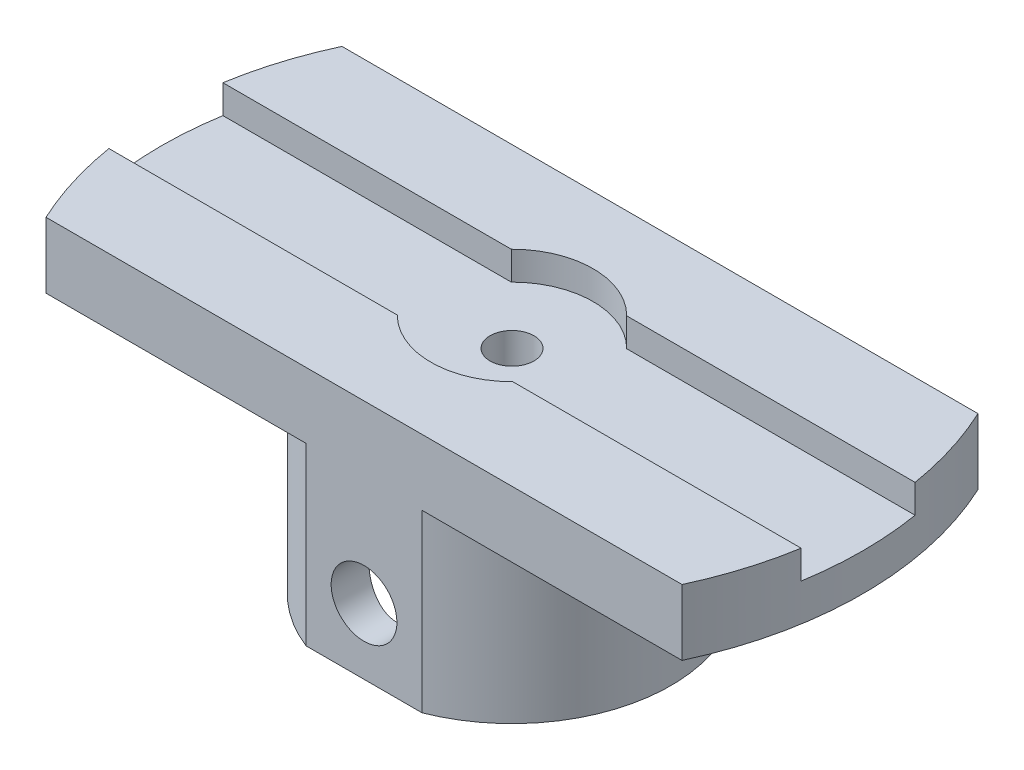
ISO-10303-21;
HEADER;
FILE_DESCRIPTION(('STEP AP214'),'2;1');
FILE_NAME('part.step','',(''),(''),'','','');
FILE_SCHEMA(('AUTOMOTIVE_DESIGN { 1 0 10303 214 1 1 1 1 }'));
ENDSEC;
DATA;
#1=APPLICATION_CONTEXT('core data for automotive mechanical design processes');
#2=APPLICATION_PROTOCOL_DEFINITION('international standard','automotive_design',2000,#1);
#3=PRODUCT_CONTEXT('',#1,'mechanical');
#4=PRODUCT('Part','Part','',(#3));
#5=PRODUCT_RELATED_PRODUCT_CATEGORY('part','',(#4));
#6=PRODUCT_DEFINITION_FORMATION('','',#4);
#7=PRODUCT_DEFINITION_CONTEXT('part definition',#1,'design');
#8=PRODUCT_DEFINITION('design','',#6,#7);
#9=PRODUCT_DEFINITION_SHAPE('','',#8);
#10=(LENGTH_UNIT() NAMED_UNIT(*) SI_UNIT(.MILLI.,.METRE.));
#11=(NAMED_UNIT(*) PLANE_ANGLE_UNIT() SI_UNIT($,.RADIAN.));
#12=(NAMED_UNIT(*) SI_UNIT($,.STERADIAN.) SOLID_ANGLE_UNIT());
#13=UNCERTAINTY_MEASURE_WITH_UNIT(LENGTH_MEASURE(1.E-05),#10,'distance_accuracy_value','');
#14=(GEOMETRIC_REPRESENTATION_CONTEXT(3) GLOBAL_UNCERTAINTY_ASSIGNED_CONTEXT((#13)) GLOBAL_UNIT_ASSIGNED_CONTEXT((#10,
#11,#12)) REPRESENTATION_CONTEXT('',''));
#15=CARTESIAN_POINT('',(0.,0.,0.));
#16=DIRECTION('',(0.,0.,1.));
#17=DIRECTION('',(1.,0.,0.));
#18=AXIS2_PLACEMENT_3D('',#15,#16,#17);
#19=CARTESIAN_POINT('',(0.,0.,0.));
#20=DIRECTION('',(0.,1.,0.));
#21=DIRECTION('',(0.,0.,1.));
#22=AXIS2_PLACEMENT_3D('',#19,#20,#21);
#23=PLANE('',#22);
#24=DIRECTION('',(-1.,0.,0.));
#25=VECTOR('',#24,1.);
#26=CARTESIAN_POINT('',(0.,0.,-6.75));
#27=LINE('',#26,#25);
#28=CARTESIAN_POINT('',(14.506464076404,0.,-6.75));
#29=VERTEX_POINT('',#28);
#30=CARTESIAN_POINT('',(2.64575131106459,0.,-6.75));
#31=VERTEX_POINT('',#30);
#32=EDGE_CURVE('E404',#29,#31,#27,.T.);
#33=ORIENTED_EDGE('',*,*,#32,.F.);
#34=CARTESIAN_POINT('',(0.,0.,0.));
#35=DIRECTION('',(0.,1.,0.));
#36=DIRECTION('',(0.,0.,1.));
#37=AXIS2_PLACEMENT_3D('',#34,#35,#36);
#38=CIRCLE('',#37,16.);
#39=CARTESIAN_POINT('',(14.506464076404,0.,6.75));
#40=VERTEX_POINT('',#39);
#41=EDGE_CURVE('E217',#40,#29,#38,.T.);
#42=ORIENTED_EDGE('',*,*,#41,.F.);
#43=DIRECTION('',(1.,0.,0.));
#44=VECTOR('',#43,1.);
#45=CARTESIAN_POINT('',(0.,0.,6.75));
#46=LINE('',#45,#44);
#47=CARTESIAN_POINT('',(2.64575131106459,0.,6.75));
#48=VERTEX_POINT('',#47);
#49=EDGE_CURVE('E394',#48,#40,#46,.T.);
#50=ORIENTED_EDGE('',*,*,#49,.F.);
#51=CARTESIAN_POINT('',(0.,0.,0.));
#52=DIRECTION('',(0.,1.,0.));
#53=DIRECTION('',(0.,0.,1.));
#54=AXIS2_PLACEMENT_3D('',#51,#52,#53);
#55=CIRCLE('',#54,7.25);
#56=EDGE_CURVE('E228',#31,#48,#55,.F.);
#57=ORIENTED_EDGE('',*,*,#56,.F.);
#58=EDGE_LOOP('',(#33,#42,#50,#57));
#59=FACE_BOUND('',#58,.T.);
#60=ADVANCED_FACE('F39',(#59),#23,.F.);
#61=CARTESIAN_POINT('',(-2.64575131106459,0.,-6.75));
#62=VERTEX_POINT('',#61);
#63=CARTESIAN_POINT('',(-14.506464076404,0.,-6.75));
#64=VERTEX_POINT('',#63);
#65=EDGE_CURVE('E405',#62,#64,#27,.T.);
#66=ORIENTED_EDGE('',*,*,#65,.F.);
#67=CARTESIAN_POINT('',(-2.64575131106459,0.,6.75));
#68=VERTEX_POINT('',#67);
#69=EDGE_CURVE('E224',#68,#62,#55,.F.);
#70=ORIENTED_EDGE('',*,*,#69,.F.);
#71=CARTESIAN_POINT('',(-14.506464076404,0.,6.75));
#72=VERTEX_POINT('',#71);
#73=EDGE_CURVE('E62',#72,#68,#46,.T.);
#74=ORIENTED_EDGE('',*,*,#73,.F.);
#75=EDGE_CURVE('E206',#64,#72,#38,.T.);
#76=ORIENTED_EDGE('',*,*,#75,.F.);
#77=EDGE_LOOP('',(#66,#70,#74,#76));
#78=FACE_BOUND('',#77,.T.);
#79=ADVANCED_FACE('F311',(#78),#23,.F.);
#80=CARTESIAN_POINT('',(0.,3.,0.));
#81=DIRECTION('',(0.,-1.,0.));
#82=DIRECTION('',(0.,0.,-1.));
#83=AXIS2_PLACEMENT_3D('',#80,#81,#82);
#84=CYLINDRICAL_SURFACE('',#83,16.);
#85=DIRECTION('',(0.,-1.,0.));
#86=VECTOR('',#85,1.);
#87=CARTESIAN_POINT('',(14.506464076404,3.,-6.75));
#88=LINE('',#87,#86);
#89=CARTESIAN_POINT('',(14.506464076404,3.,-6.75));
#90=VERTEX_POINT('',#89);
#91=EDGE_CURVE('E407',#90,#29,#88,.T.);
#92=ORIENTED_EDGE('',*,*,#91,.F.);
#93=CARTESIAN_POINT('',(0.,3.,0.));
#94=DIRECTION('',(0.,1.,0.));
#95=DIRECTION('',(0.,0.,1.));
#96=AXIS2_PLACEMENT_3D('',#93,#94,#95);
#97=CIRCLE('',#96,16.);
#98=CARTESIAN_POINT('',(15.7873366974927,3.,-2.6));
#99=VERTEX_POINT('',#98);
#100=EDGE_CURVE('E216',#99,#90,#97,.T.);
#101=ORIENTED_EDGE('',*,*,#100,.F.);
#102=DIRECTION('',(0.,1.,0.));
#103=VECTOR('',#102,1.);
#104=CARTESIAN_POINT('',(15.7873366974927,1.7,-2.6));
#105=LINE('',#104,#103);
#106=CARTESIAN_POINT('',(15.7873366974927,1.7,-2.6));
#107=VERTEX_POINT('',#106);
#108=EDGE_CURVE('E207',#107,#99,#105,.T.);
#109=ORIENTED_EDGE('',*,*,#108,.F.);
#110=CARTESIAN_POINT('',(1.83880688453542E-13,1.7,0.));
#111=DIRECTION('',(0.,1.,0.));
#112=DIRECTION('',(0.,0.,-1.));
#113=AXIS2_PLACEMENT_3D('',#110,#111,#112);
#114=CIRCLE('',#113,15.9999999999998);
#115=CARTESIAN_POINT('',(15.7873366974927,1.7,2.6));
#116=VERTEX_POINT('',#115);
#117=EDGE_CURVE('E179',#116,#107,#114,.T.);
#118=ORIENTED_EDGE('',*,*,#117,.F.);
#119=DIRECTION('',(0.,1.,0.));
#120=VECTOR('',#119,1.);
#121=CARTESIAN_POINT('',(15.7873366974927,1.7,2.6));
#122=LINE('',#121,#120);
#123=CARTESIAN_POINT('',(15.7873366974927,3.,2.6));
#124=VERTEX_POINT('',#123);
#125=EDGE_CURVE('E177',#116,#124,#122,.T.);
#126=ORIENTED_EDGE('',*,*,#125,.T.);
#127=CARTESIAN_POINT('',(14.506464076404,3.,6.75));
#128=VERTEX_POINT('',#127);
#129=EDGE_CURVE('E215',#128,#124,#97,.T.);
#130=ORIENTED_EDGE('',*,*,#129,.F.);
#131=DIRECTION('',(0.,-1.,0.));
#132=VECTOR('',#131,1.);
#133=CARTESIAN_POINT('',(14.506464076404,3.,6.75));
#134=LINE('',#133,#132);
#135=EDGE_CURVE('E390',#40,#128,#134,.F.);
#136=ORIENTED_EDGE('',*,*,#135,.F.);
#137=ORIENTED_EDGE('',*,*,#41,.T.);
#138=EDGE_LOOP('',(#92,#101,#109,#118,#126,#130,#136,#137));
#139=FACE_BOUND('',#138,.T.);
#140=ADVANCED_FACE('F41',(#139),#84,.T.);
#141=DIRECTION('',(0.,-1.,0.));
#142=VECTOR('',#141,1.);
#143=CARTESIAN_POINT('',(-14.506464076404,3.,-6.75));
#144=LINE('',#143,#142);
#145=CARTESIAN_POINT('',(-14.506464076404,3.,-6.75));
#146=VERTEX_POINT('',#145);
#147=EDGE_CURVE('E54',#64,#146,#144,.F.);
#148=ORIENTED_EDGE('',*,*,#147,.F.);
#149=ORIENTED_EDGE('',*,*,#75,.T.);
#150=DIRECTION('',(0.,-1.,0.));
#151=VECTOR('',#150,1.);
#152=CARTESIAN_POINT('',(-14.506464076404,3.,6.75));
#153=LINE('',#152,#151);
#154=CARTESIAN_POINT('',(-14.506464076404,3.,6.75));
#155=VERTEX_POINT('',#154);
#156=EDGE_CURVE('E395',#155,#72,#153,.T.);
#157=ORIENTED_EDGE('',*,*,#156,.F.);
#158=CARTESIAN_POINT('',(-15.7873366974927,3.,2.6));
#159=VERTEX_POINT('',#158);
#160=EDGE_CURVE('E211',#159,#155,#97,.T.);
#161=ORIENTED_EDGE('',*,*,#160,.F.);
#162=DIRECTION('',(0.,1.,0.));
#163=VECTOR('',#162,1.);
#164=CARTESIAN_POINT('',(-15.7873366974927,1.7,2.6));
#165=LINE('',#164,#163);
#166=CARTESIAN_POINT('',(-15.7873366974927,1.7,2.6));
#167=VERTEX_POINT('',#166);
#168=EDGE_CURVE('E191',#167,#159,#165,.T.);
#169=ORIENTED_EDGE('',*,*,#168,.F.);
#170=CARTESIAN_POINT('',(-1.33573707650214E-13,1.7,0.));
#171=DIRECTION('',(0.,1.,0.));
#172=DIRECTION('',(0.,0.,1.));
#173=AXIS2_PLACEMENT_3D('',#170,#171,#172);
#174=CIRCLE('',#173,15.9999999999999);
#175=CARTESIAN_POINT('',(-15.7873366974927,1.7,-2.6));
#176=VERTEX_POINT('',#175);
#177=EDGE_CURVE('E183',#176,#167,#174,.T.);
#178=ORIENTED_EDGE('',*,*,#177,.F.);
#179=DIRECTION('',(0.,1.,0.));
#180=VECTOR('',#179,1.);
#181=CARTESIAN_POINT('',(-15.7873366974927,1.7,-2.6));
#182=LINE('',#181,#180);
#183=CARTESIAN_POINT('',(-15.7873366974927,3.,-2.6));
#184=VERTEX_POINT('',#183);
#185=EDGE_CURVE('E203',#176,#184,#182,.T.);
#186=ORIENTED_EDGE('',*,*,#185,.T.);
#187=EDGE_CURVE('E214',#146,#184,#97,.T.);
#188=ORIENTED_EDGE('',*,*,#187,.F.);
#189=EDGE_LOOP('',(#148,#149,#157,#161,#169,#178,#186,#188));
#190=FACE_BOUND('',#189,.T.);
#191=ADVANCED_FACE('F243',(#190),#84,.T.);
#192=CARTESIAN_POINT('',(0.,-8.,0.));
#193=DIRECTION('',(0.,-1.,0.));
#194=DIRECTION('',(0.,0.,-1.));
#195=AXIS2_PLACEMENT_3D('',#192,#193,#194);
#196=PLANE('',#195);
#197=CARTESIAN_POINT('',(0.,-8.,0.));
#198=DIRECTION('',(0.,-1.,0.));
#199=DIRECTION('',(0.,0.,-1.));
#200=AXIS2_PLACEMENT_3D('',#197,#198,#199);
#201=CIRCLE('',#200,5.25);
#202=CARTESIAN_POINT('',(0.,-8.,-5.25));
#203=VERTEX_POINT('',#202);
#204=EDGE_CURVE('E377',#203,#203,#201,.T.);
#205=ORIENTED_EDGE('',*,*,#204,.F.);
#206=EDGE_LOOP('',(#205));
#207=FACE_BOUND('',#206,.T.);
#208=CARTESIAN_POINT('',(0.,-8.,0.));
#209=DIRECTION('',(0.,-1.,0.));
#210=DIRECTION('',(1.,0.,0.));
#211=AXIS2_PLACEMENT_3D('',#208,#209,#210);
#212=CIRCLE('',#211,7.25);
#213=CARTESIAN_POINT('',(-2.64575131106459,-8.,6.75));
#214=VERTEX_POINT('',#213);
#215=CARTESIAN_POINT('',(-2.64575131106458,-8.,-6.75));
#216=VERTEX_POINT('',#215);
#217=EDGE_CURVE('E223',#214,#216,#212,.T.);
#218=ORIENTED_EDGE('',*,*,#217,.T.);
#219=DIRECTION('',(1.,0.,0.));
#220=VECTOR('',#219,1.);
#221=CARTESIAN_POINT('',(0.,-8.,-6.75));
#222=LINE('',#221,#220);
#223=CARTESIAN_POINT('',(2.64575131106458,-8.,-6.75));
#224=VERTEX_POINT('',#223);
#225=EDGE_CURVE('E382',#216,#224,#222,.T.);
#226=ORIENTED_EDGE('',*,*,#225,.T.);
#227=CARTESIAN_POINT('',(2.64575131106459,-8.,6.75));
#228=VERTEX_POINT('',#227);
#229=EDGE_CURVE('E387',#224,#228,#212,.T.);
#230=ORIENTED_EDGE('',*,*,#229,.T.);
#231=DIRECTION('',(-1.,0.,0.));
#232=VECTOR('',#231,1.);
#233=CARTESIAN_POINT('',(0.,-8.,6.75));
#234=LINE('',#233,#232);
#235=EDGE_CURVE('E385',#228,#214,#234,.T.);
#236=ORIENTED_EDGE('',*,*,#235,.T.);
#237=EDGE_LOOP('',(#218,#226,#230,#236));
#238=FACE_BOUND('',#237,.T.);
#239=ADVANCED_FACE('F367',(#207,#238),#196,.T.);
#240=CARTESIAN_POINT('',(0.,-8.,0.));
#241=DIRECTION('',(0.,1.,0.));
#242=DIRECTION('',(0.,0.,1.));
#243=AXIS2_PLACEMENT_3D('',#240,#241,#242);
#244=CYLINDRICAL_SURFACE('',#243,7.25);
#245=DIRECTION('',(0.,1.,0.));
#246=VECTOR('',#245,1.);
#247=CARTESIAN_POINT('',(-2.64575131106458,-8.,-6.75));
#248=LINE('',#247,#246);
#249=EDGE_CURVE('E400',#216,#62,#248,.T.);
#250=ORIENTED_EDGE('',*,*,#249,.F.);
#251=ORIENTED_EDGE('',*,*,#217,.F.);
#252=DIRECTION('',(0.,1.,0.));
#253=VECTOR('',#252,1.);
#254=CARTESIAN_POINT('',(-2.64575131106459,-8.,6.75));
#255=LINE('',#254,#253);
#256=EDGE_CURVE('E227',#68,#214,#255,.F.);
#257=ORIENTED_EDGE('',*,*,#256,.F.);
#258=ORIENTED_EDGE('',*,*,#69,.T.);
#259=EDGE_LOOP('',(#250,#251,#257,#258));
#260=FACE_BOUND('',#259,.T.);
#261=ADVANCED_FACE('F364',(#260),#244,.T.);
#262=DIRECTION('',(0.,1.,0.));
#263=VECTOR('',#262,1.);
#264=CARTESIAN_POINT('',(2.64575131106458,-8.,-6.75));
#265=LINE('',#264,#263);
#266=EDGE_CURVE('E402',#31,#224,#265,.F.);
#267=ORIENTED_EDGE('',*,*,#266,.F.);
#268=ORIENTED_EDGE('',*,*,#56,.T.);
#269=DIRECTION('',(0.,1.,0.));
#270=VECTOR('',#269,1.);
#271=CARTESIAN_POINT('',(2.64575131106459,-8.,6.75));
#272=LINE('',#271,#270);
#273=EDGE_CURVE('E230',#228,#48,#272,.T.);
#274=ORIENTED_EDGE('',*,*,#273,.F.);
#275=ORIENTED_EDGE('',*,*,#229,.F.);
#276=EDGE_LOOP('',(#267,#268,#274,#275));
#277=FACE_BOUND('',#276,.T.);
#278=ADVANCED_FACE('F366',(#277),#244,.T.);
#279=CARTESIAN_POINT('',(0.,3.,0.));
#280=DIRECTION('',(0.,1.,0.));
#281=DIRECTION('',(0.,0.,1.));
#282=AXIS2_PLACEMENT_3D('',#279,#280,#281);
#283=PLANE('',#282);
#284=CARTESIAN_POINT('',(0.,3.,0.));
#285=DIRECTION('',(0.,1.,0.));
#286=DIRECTION('',(0.,0.,1.));
#287=AXIS2_PLACEMENT_3D('',#284,#285,#286);
#288=CIRCLE('',#287,3.7);
#289=CARTESIAN_POINT('',(2.63248931621764,3.,-2.6));
#290=VERTEX_POINT('',#289);
#291=CARTESIAN_POINT('',(-2.63248931621764,3.,-2.6));
#292=VERTEX_POINT('',#291);
#293=EDGE_CURVE('E173',#290,#292,#288,.T.);
#294=ORIENTED_EDGE('',*,*,#293,.F.);
#295=DIRECTION('',(-1.,0.,0.));
#296=VECTOR('',#295,1.);
#297=CARTESIAN_POINT('',(2.343074902772,3.,-2.6));
#298=LINE('',#297,#296);
#299=EDGE_CURVE('E198',#99,#290,#298,.T.);
#300=ORIENTED_EDGE('',*,*,#299,.F.);
#301=ORIENTED_EDGE('',*,*,#100,.T.);
#302=DIRECTION('',(-1.,0.,0.));
#303=VECTOR('',#302,1.);
#304=CARTESIAN_POINT('',(0.,3.,-6.75));
#305=LINE('',#304,#303);
#306=EDGE_CURVE('E47',#90,#146,#305,.T.);
#307=ORIENTED_EDGE('',*,*,#306,.T.);
#308=ORIENTED_EDGE('',*,*,#187,.T.);
#309=DIRECTION('',(-1.,0.,0.));
#310=VECTOR('',#309,1.);
#311=CARTESIAN_POINT('',(-15.7873366974927,3.,-2.6));
#312=LINE('',#311,#310);
#313=EDGE_CURVE('E201',#292,#184,#312,.T.);
#314=ORIENTED_EDGE('',*,*,#313,.F.);
#315=EDGE_LOOP('',(#294,#300,#301,#307,#308,#314));
#316=FACE_BOUND('',#315,.T.);
#317=ADVANCED_FACE('F237',(#316),#283,.T.);
#318=CARTESIAN_POINT('',(-2.63248931621764,3.,2.6));
#319=VERTEX_POINT('',#318);
#320=CARTESIAN_POINT('',(2.63248931621764,3.,2.6));
#321=VERTEX_POINT('',#320);
#322=EDGE_CURVE('E157',#319,#321,#288,.T.);
#323=ORIENTED_EDGE('',*,*,#322,.F.);
#324=DIRECTION('',(1.,0.,0.));
#325=VECTOR('',#324,1.);
#326=CARTESIAN_POINT('',(-15.7873366974927,3.,2.6));
#327=LINE('',#326,#325);
#328=EDGE_CURVE('E192',#159,#319,#327,.T.);
#329=ORIENTED_EDGE('',*,*,#328,.F.);
#330=ORIENTED_EDGE('',*,*,#160,.T.);
#331=DIRECTION('',(1.,0.,0.));
#332=VECTOR('',#331,1.);
#333=CARTESIAN_POINT('',(0.,3.,6.75));
#334=LINE('',#333,#332);
#335=EDGE_CURVE('E252',#155,#128,#334,.T.);
#336=ORIENTED_EDGE('',*,*,#335,.T.);
#337=ORIENTED_EDGE('',*,*,#129,.T.);
#338=DIRECTION('',(1.,0.,0.));
#339=VECTOR('',#338,1.);
#340=CARTESIAN_POINT('',(2.343074902772,3.,2.6));
#341=LINE('',#340,#339);
#342=EDGE_CURVE('E195',#321,#124,#341,.T.);
#343=ORIENTED_EDGE('',*,*,#342,.F.);
#344=EDGE_LOOP('',(#323,#329,#330,#336,#337,#343));
#345=FACE_BOUND('',#344,.T.);
#346=ADVANCED_FACE('F251',(#345),#283,.T.);
#347=CARTESIAN_POINT('',(0.,0.,0.));
#348=DIRECTION('',(0.,-1.,0.));
#349=DIRECTION('',(0.,0.,-1.));
#350=AXIS2_PLACEMENT_3D('',#347,#348,#349);
#351=CIRCLE('',#350,5.25);
#352=CARTESIAN_POINT('',(0.,0.,-5.25));
#353=VERTEX_POINT('',#352);
#354=EDGE_CURVE('E331',#353,#353,#351,.T.);
#355=ORIENTED_EDGE('',*,*,#354,.T.);
#356=EDGE_LOOP('',(#355));
#357=FACE_BOUND('',#356,.T.);
#358=CARTESIAN_POINT('',(0.,0.,0.));
#359=DIRECTION('',(0.,1.,0.));
#360=DIRECTION('',(0.,0.,1.));
#361=AXIS2_PLACEMENT_3D('',#358,#359,#360);
#362=CIRCLE('',#361,1.);
#363=CARTESIAN_POINT('',(0.,0.,1.));
#364=VERTEX_POINT('',#363);
#365=EDGE_CURVE('E196',#364,#364,#362,.F.);
#366=ORIENTED_EDGE('',*,*,#365,.F.);
#367=EDGE_LOOP('',(#366));
#368=FACE_BOUND('',#367,.T.);
#369=ADVANCED_FACE('F313',(#357,#368),#23,.F.);
#370=CARTESIAN_POINT('',(-1.33573707650214E-13,1.7,0.));
#371=DIRECTION('',(0.,1.,0.));
#372=DIRECTION('',(0.,0.,1.));
#373=AXIS2_PLACEMENT_3D('',#370,#371,#372);
#374=PLANE('',#373);
#375=DIRECTION('',(1.,0.,0.));
#376=VECTOR('',#375,1.);
#377=CARTESIAN_POINT('',(-15.7873366974927,1.7,2.6));
#378=LINE('',#377,#376);
#379=CARTESIAN_POINT('',(-2.63248931621764,1.7,2.6));
#380=VERTEX_POINT('',#379);
#381=EDGE_CURVE('E172',#167,#380,#378,.T.);
#382=ORIENTED_EDGE('',*,*,#381,.T.);
#383=CARTESIAN_POINT('',(0.,1.7,0.));
#384=DIRECTION('',(0.,1.,0.));
#385=DIRECTION('',(0.,0.,1.));
#386=AXIS2_PLACEMENT_3D('',#383,#384,#385);
#387=CIRCLE('',#386,3.7);
#388=CARTESIAN_POINT('',(2.63248931621764,1.7,2.6));
#389=VERTEX_POINT('',#388);
#390=EDGE_CURVE('E155',#380,#389,#387,.T.);
#391=ORIENTED_EDGE('',*,*,#390,.T.);
#392=DIRECTION('',(1.,0.,0.));
#393=VECTOR('',#392,1.);
#394=CARTESIAN_POINT('',(2.343074902772,1.7,2.6));
#395=LINE('',#394,#393);
#396=EDGE_CURVE('E169',#389,#116,#395,.T.);
#397=ORIENTED_EDGE('',*,*,#396,.T.);
#398=ORIENTED_EDGE('',*,*,#117,.T.);
#399=DIRECTION('',(-1.,0.,0.));
#400=VECTOR('',#399,1.);
#401=CARTESIAN_POINT('',(2.343074902772,1.7,-2.6));
#402=LINE('',#401,#400);
#403=CARTESIAN_POINT('',(2.63248931621764,1.7,-2.6));
#404=VERTEX_POINT('',#403);
#405=EDGE_CURVE('E181',#107,#404,#402,.T.);
#406=ORIENTED_EDGE('',*,*,#405,.T.);
#407=CARTESIAN_POINT('',(-2.63248931621764,1.7,-2.6));
#408=VERTEX_POINT('',#407);
#409=EDGE_CURVE('E162',#404,#408,#387,.T.);
#410=ORIENTED_EDGE('',*,*,#409,.T.);
#411=DIRECTION('',(-1.,0.,0.));
#412=VECTOR('',#411,1.);
#413=CARTESIAN_POINT('',(-15.7873366974927,1.7,-2.6));
#414=LINE('',#413,#412);
#415=EDGE_CURVE('E189',#408,#176,#414,.T.);
#416=ORIENTED_EDGE('',*,*,#415,.T.);
#417=ORIENTED_EDGE('',*,*,#177,.T.);
#418=EDGE_LOOP('',(#382,#391,#397,#398,#406,#410,#416,#417));
#419=FACE_BOUND('',#418,.T.);
#420=CARTESIAN_POINT('',(0.,1.7,0.));
#421=DIRECTION('',(0.,1.,0.));
#422=DIRECTION('',(0.,0.,1.));
#423=AXIS2_PLACEMENT_3D('',#420,#421,#422);
#424=CIRCLE('',#423,1.);
#425=CARTESIAN_POINT('',(0.,1.7,1.));
#426=VERTEX_POINT('',#425);
#427=EDGE_CURVE('E220',#426,#426,#424,.F.);
#428=ORIENTED_EDGE('',*,*,#427,.T.);
#429=EDGE_LOOP('',(#428));
#430=FACE_BOUND('',#429,.T.);
#431=ADVANCED_FACE('F166',(#419,#430),#374,.T.);
#432=CARTESIAN_POINT('',(-15.7873366974927,1.7,-2.6));
#433=DIRECTION('',(0.,0.,-1.));
#434=DIRECTION('',(-1.,0.,0.));
#435=AXIS2_PLACEMENT_3D('',#432,#433,#434);
#436=PLANE('',#435);
#437=ORIENTED_EDGE('',*,*,#415,.F.);
#438=DIRECTION('',(0.,1.,0.));
#439=VECTOR('',#438,1.);
#440=CARTESIAN_POINT('',(-2.63248931621764,1.7,-2.6));
#441=LINE('',#440,#439);
#442=EDGE_CURVE('E262',#408,#292,#441,.T.);
#443=ORIENTED_EDGE('',*,*,#442,.T.);
#444=ORIENTED_EDGE('',*,*,#313,.T.);
#445=ORIENTED_EDGE('',*,*,#185,.F.);
#446=EDGE_LOOP('',(#437,#443,#444,#445));
#447=FACE_BOUND('',#446,.T.);
#448=ADVANCED_FACE('F326',(#447),#436,.F.);
#449=CARTESIAN_POINT('',(2.343074902772,1.7,-2.6));
#450=DIRECTION('',(0.,0.,-1.));
#451=DIRECTION('',(-1.,0.,0.));
#452=AXIS2_PLACEMENT_3D('',#449,#450,#451);
#453=PLANE('',#452);
#454=ORIENTED_EDGE('',*,*,#299,.T.);
#455=DIRECTION('',(0.,1.,0.));
#456=VECTOR('',#455,1.);
#457=CARTESIAN_POINT('',(2.63248931621764,1.7,-2.6));
#458=LINE('',#457,#456);
#459=EDGE_CURVE('E161',#290,#404,#458,.F.);
#460=ORIENTED_EDGE('',*,*,#459,.T.);
#461=ORIENTED_EDGE('',*,*,#405,.F.);
#462=ORIENTED_EDGE('',*,*,#108,.T.);
#463=EDGE_LOOP('',(#454,#460,#461,#462));
#464=FACE_BOUND('',#463,.T.);
#465=ADVANCED_FACE('F260',(#464),#453,.F.);
#466=CARTESIAN_POINT('',(2.343074902772,1.7,2.6));
#467=DIRECTION('',(0.,0.,1.));
#468=DIRECTION('',(1.,0.,0.));
#469=AXIS2_PLACEMENT_3D('',#466,#467,#468);
#470=PLANE('',#469);
#471=ORIENTED_EDGE('',*,*,#396,.F.);
#472=DIRECTION('',(0.,1.,0.));
#473=VECTOR('',#472,1.);
#474=CARTESIAN_POINT('',(2.63248931621764,1.7,2.6));
#475=LINE('',#474,#473);
#476=EDGE_CURVE('E152',#389,#321,#475,.T.);
#477=ORIENTED_EDGE('',*,*,#476,.T.);
#478=ORIENTED_EDGE('',*,*,#342,.T.);
#479=ORIENTED_EDGE('',*,*,#125,.F.);
#480=EDGE_LOOP('',(#471,#477,#478,#479));
#481=FACE_BOUND('',#480,.T.);
#482=ADVANCED_FACE('F175',(#481),#470,.F.);
#483=CARTESIAN_POINT('',(-15.7873366974927,1.7,2.6));
#484=DIRECTION('',(0.,0.,1.));
#485=DIRECTION('',(1.,0.,0.));
#486=AXIS2_PLACEMENT_3D('',#483,#484,#485);
#487=PLANE('',#486);
#488=ORIENTED_EDGE('',*,*,#328,.T.);
#489=DIRECTION('',(0.,1.,0.));
#490=VECTOR('',#489,1.);
#491=CARTESIAN_POINT('',(-2.63248931621764,1.7,2.6));
#492=LINE('',#491,#490);
#493=EDGE_CURVE('E12',#319,#380,#492,.F.);
#494=ORIENTED_EDGE('',*,*,#493,.T.);
#495=ORIENTED_EDGE('',*,*,#381,.F.);
#496=ORIENTED_EDGE('',*,*,#168,.T.);
#497=EDGE_LOOP('',(#488,#494,#495,#496));
#498=FACE_BOUND('',#497,.T.);
#499=ADVANCED_FACE('F343',(#498),#487,.F.);
#500=CARTESIAN_POINT('',(0.,-1.7,0.));
#501=DIRECTION('',(0.,1.,0.));
#502=DIRECTION('',(0.,0.,1.));
#503=AXIS2_PLACEMENT_3D('',#500,#501,#502);
#504=CYLINDRICAL_SURFACE('',#503,1.);
#505=ORIENTED_EDGE('',*,*,#427,.F.);
#506=EDGE_LOOP('',(#505));
#507=FACE_BOUND('',#506,.T.);
#508=ORIENTED_EDGE('',*,*,#365,.T.);
#509=EDGE_LOOP('',(#508));
#510=FACE_BOUND('',#509,.T.);
#511=ADVANCED_FACE('F307',(#507,#510),#504,.F.);
#512=CARTESIAN_POINT('',(0.,-8.,0.));
#513=DIRECTION('',(0.,1.,0.));
#514=DIRECTION('',(0.,0.,1.));
#515=AXIS2_PLACEMENT_3D('',#512,#513,#514);
#516=CYLINDRICAL_SURFACE('',#515,5.25);
#517=CARTESIAN_POINT('',(0.,-6.5,5.25));
#518=CARTESIAN_POINT('',(-0.0824661767829385,-6.49999854532854,5.24999901970756));
#519=CARTESIAN_POINT('',(-0.164947310904436,-6.49317665826792,5.24803813051532));
#520=CARTESIAN_POINT('',(-0.327518993397741,-6.46612679742327,5.24040679458827));
#521=CARTESIAN_POINT('',(-0.407608625122212,-6.44589375044443,5.23473494407563));
#522=CARTESIAN_POINT('',(-0.563028225553403,-6.39274397118762,5.22030518511805));
#523=CARTESIAN_POINT('',(-0.638364660636168,-6.35984492288604,5.21155158079756));
#524=CARTESIAN_POINT('',(-0.782451570846954,-6.28236650639124,5.19187483737408));
#525=CARTESIAN_POINT('',(-0.851201355883624,-6.23778591613224,5.18095147131017));
#526=CARTESIAN_POINT('',(-0.981970835144209,-6.13697374199532,5.15778550969185));
#527=CARTESIAN_POINT('',(-1.0437927917857,-6.08049143460855,5.14551781458893));
#528=CARTESIAN_POINT('',(-1.15722851844326,-5.95801419264674,5.12120051186731));
#529=CARTESIAN_POINT('',(-1.20884075780837,-5.89201783427583,5.10915093719508));
#530=CARTESIAN_POINT('',(-1.30139842504823,-5.75075481290682,5.08637261156541));
#531=CARTESIAN_POINT('',(-1.34210865827511,-5.67532851120135,5.07567526879513));
#532=CARTESIAN_POINT('',(-1.41018877915485,-5.51834599118693,5.057185078805));
#533=CARTESIAN_POINT('',(-1.43756153666789,-5.43679109594683,5.04939160683653));
#534=CARTESIAN_POINT('',(-1.47748824760406,-5.27207392762585,5.03785206147012));
#535=CARTESIAN_POINT('',(-1.49040414902137,-5.18900647792413,5.03400733927508));
#536=CARTESIAN_POINT('',(-1.50218000841888,-5.02180163866543,5.03050656151496));
#537=CARTESIAN_POINT('',(-1.50104302057216,-4.93766448556234,5.03084959580709));
#538=CARTESIAN_POINT('',(-1.48503101072177,-4.77359854140788,5.0355977580745));
#539=CARTESIAN_POINT('',(-1.47060244296293,-4.69362173661443,5.03987087023452));
#540=CARTESIAN_POINT('',(-1.42913539564342,-4.53727458527931,5.05178511287108));
#541=CARTESIAN_POINT('',(-1.40209577610937,-4.46090456545963,5.05942654782303));
#542=CARTESIAN_POINT('',(-1.33583010853359,-4.31281531667614,5.0773264763706));
#543=CARTESIAN_POINT('',(-1.29645413379661,-4.24116719569875,5.08761687304236));
#544=CARTESIAN_POINT('',(-1.20673784375913,-4.10534257908995,5.10963912661544));
#545=CARTESIAN_POINT('',(-1.15639508755009,-4.04116775169882,5.12137130416434));
#546=CARTESIAN_POINT('',(-1.04392799754766,-3.91957071829523,5.14549687992267));
#547=CARTESIAN_POINT('',(-0.981431156133996,-3.86249414302458,5.15789853429274));
#548=CARTESIAN_POINT('',(-0.847599211789669,-3.75955549726979,5.18157185413758));
#549=CARTESIAN_POINT('',(-0.776263651111419,-3.71369400796872,5.19284346103369));
#550=CARTESIAN_POINT('',(-0.626192304818584,-3.63430344891947,5.21307396049126));
#551=CARTESIAN_POINT('',(-0.547417363357504,-3.60084478489686,5.22201956622922));
#552=CARTESIAN_POINT('',(-0.385044922475602,-3.54774958143738,5.23649438615689));
#553=CARTESIAN_POINT('',(-0.30144864435761,-3.52810955806605,5.24202446142191));
#554=CARTESIAN_POINT('',(-0.134749791483262,-3.50377003571791,5.24891155886005));
#555=CARTESIAN_POINT('',(-0.0517210101453803,-3.49860147847023,5.25039954637952));
#556=CARTESIAN_POINT('',(0.114019895104187,-3.50204544972578,5.24941563530316));
#557=CARTESIAN_POINT('',(0.196732055817829,-3.51065632463444,5.24694421185463));
#558=CARTESIAN_POINT('',(0.357763975072738,-3.5410328332372,5.23840445013913));
#559=CARTESIAN_POINT('',(0.436138658801141,-3.56252988599257,5.23240959763292));
#560=CARTESIAN_POINT('',(0.588156514654222,-3.61775037648848,5.21750999056379));
#561=CARTESIAN_POINT('',(0.661799138436506,-3.65147522816691,5.20860489949282));
#562=CARTESIAN_POINT('',(0.804031263840056,-3.73101750248393,5.18857470876985));
#563=CARTESIAN_POINT('',(0.87247686490519,-3.77708089911934,5.17740572384231));
#564=CARTESIAN_POINT('',(1.00082889604448,-3.87968937946298,5.15413460323354));
#565=CARTESIAN_POINT('',(1.06073337813182,-3.93623684754715,5.14203225564551));
#566=CARTESIAN_POINT('',(1.17232982125553,-4.0604070065384,5.11776464723921));
#567=CARTESIAN_POINT('',(1.22368907055716,-4.12833145667427,5.10561027650693));
#568=CARTESIAN_POINT('',(1.31429648704887,-4.27209694146351,5.08304171044126));
#569=CARTESIAN_POINT('',(1.35354507560828,-4.34793770055981,5.0726274545694));
#570=CARTESIAN_POINT('',(1.41853090589126,-4.50506840824382,5.05483988458072));
#571=CARTESIAN_POINT('',(1.44433974931832,-4.58632682267951,5.04745050118527));
#572=CARTESIAN_POINT('',(1.48184587553056,-4.75228245174079,5.03656842598251));
#573=CARTESIAN_POINT('',(1.49354743426742,-4.83697861632651,5.0330745534607));
#574=CARTESIAN_POINT('',(1.50223518184644,-5.00397202469116,5.03048777321363));
#575=CARTESIAN_POINT('',(1.49976020733171,-5.08623912841444,5.03123370599554));
#576=CARTESIAN_POINT('',(1.48143533218232,-5.24913104799933,5.03665947911099));
#577=CARTESIAN_POINT('',(1.4655858778494,-5.32975591856975,5.04133918817575));
#578=CARTESIAN_POINT('',(1.42129476612471,-5.48628377837564,5.05400232868674));
#579=CARTESIAN_POINT('',(1.39298318839765,-5.56222654025816,5.06195157786269));
#580=CARTESIAN_POINT('',(1.32467211976195,-5.70834405086937,5.08025477132046));
#581=CARTESIAN_POINT('',(1.28467056032367,-5.77851777595498,5.0906091411192));
#582=CARTESIAN_POINT('',(1.19254909901119,-5.91363764135394,5.11298751712321));
#583=CARTESIAN_POINT('',(1.14006920792048,-5.97833104350645,5.12505572384263));
#584=CARTESIAN_POINT('',(1.02514488028452,-6.09816792185738,5.14927383819209));
#585=CARTESIAN_POINT('',(0.96269793804642,-6.1533089893331,5.16142376562885));
#586=CARTESIAN_POINT('',(0.827680740649043,-6.25387788824496,5.18480969679264));
#587=CARTESIAN_POINT('',(0.754891876769835,-6.29902024045222,5.19601425778057));
#588=CARTESIAN_POINT('',(0.602437897234997,-6.37635933876651,5.21588546833481));
#589=CARTESIAN_POINT('',(0.522776568086055,-6.4085631589498,5.22455350402716));
#590=CARTESIAN_POINT('',(0.369687236501276,-6.45563566354659,5.2374550854398));
#591=CARTESIAN_POINT('',(0.296822255718293,-6.47223015251342,5.24212263271557));
#592=CARTESIAN_POINT('',(0.149308776589775,-6.49441224293161,5.24839532889111));
#593=CARTESIAN_POINT('',(0.0746605182120686,-6.50000131698266,5.25000088750497));
#594=CARTESIAN_POINT('',(0.,-6.5,5.25));
#595=B_SPLINE_CURVE_WITH_KNOTS('',3,(#517,#518,#519,#520,#521,#522,#523,#524,#525,#526,#527,
#528,#529,#530,#531,#532,#533,#534,#535,#536,#537,#538,#539,#540,#541,#542,#543,#544,#545,#546,
#547,#548,#549,#550,#551,#552,#553,#554,#555,#556,#557,#558,#559,#560,#561,#562,#563,#564,#565,
#566,#567,#568,#569,#570,#571,#572,#573,#574,#575,#576,#577,#578,#579,#580,#581,#582,#583,#584,
#585,#586,#587,#588,#589,#590,#591,#592,#593,#594),.UNSPECIFIED.,.T.,.F.,(4,2,2,2,2,2,2,2,2,2,2,
2,2,2,2,2,2,2,2,2,2,2,2,2,2,2,2,2,2,2,2,2,2,2,2,2,2,2,4),(0.,0.247124484406758,
0.494342504846385,0.741216609671508,0.988116551576369,1.24085858648086,1.49363848405285,
1.75149806475043,2.00930213658607,2.26049632397062,2.51163591923425,2.75463589372,
2.99765783839594,3.24375602468408,3.48990904183007,3.74533875451876,4.00078170116587,
4.25765325828337,4.51446003010959,4.76284093273651,5.01119203075986,5.2545385535964,
5.49791322431647,5.74655644008339,5.99525627390841,6.25209078663251,6.50891636223974,
6.76435930022607,7.01972479336604,7.26545011208157,7.51116723135287,7.75437822214251,
7.99763227493985,8.24900742663575,8.50044587327157,8.75833484223426,9.01608261921369,
9.23984601024262,9.46357945816592),.UNSPECIFIED.);
#596=CARTESIAN_POINT('',(0.,-6.5,5.25));
#597=VERTEX_POINT('',#596);
#598=EDGE_CURVE('E281',#597,#597,#595,.T.);
#599=ORIENTED_EDGE('',*,*,#598,.F.);
#600=EDGE_LOOP('',(#599));
#601=FACE_BOUND('',#600,.T.);
#602=CARTESIAN_POINT('',(0.,-3.5,-5.25));
#603=CARTESIAN_POINT('',(-0.0824661767829385,-3.50000145467146,-5.24999901970756));
#604=CARTESIAN_POINT('',(-0.164947310904436,-3.50682334173209,-5.24803813051532));
#605=CARTESIAN_POINT('',(-0.327518993397741,-3.53387320257673,-5.24040679458827));
#606=CARTESIAN_POINT('',(-0.407608625122212,-3.55410624955557,-5.23473494407563));
#607=CARTESIAN_POINT('',(-0.563028225553403,-3.60725602881238,-5.22030518511805));
#608=CARTESIAN_POINT('',(-0.638364660636168,-3.64015507711396,-5.21155158079756));
#609=CARTESIAN_POINT('',(-0.782451570846953,-3.71763349360876,-5.19187483737408));
#610=CARTESIAN_POINT('',(-0.851201355883623,-3.76221408386777,-5.18095147131017));
#611=CARTESIAN_POINT('',(-0.981970835144209,-3.86302625800469,-5.15778550969185));
#612=CARTESIAN_POINT('',(-1.0437927917857,-3.91950856539145,-5.14551781458893));
#613=CARTESIAN_POINT('',(-1.15722851844326,-4.04198580735326,-5.12120051186731));
#614=CARTESIAN_POINT('',(-1.20884075780837,-4.10798216572417,-5.10915093719508));
#615=CARTESIAN_POINT('',(-1.30139842504823,-4.24924518709319,-5.08637261156541));
#616=CARTESIAN_POINT('',(-1.34210865827511,-4.32467148879865,-5.07567526879513));
#617=CARTESIAN_POINT('',(-1.41018877915485,-4.48165400881307,-5.057185078805));
#618=CARTESIAN_POINT('',(-1.43756153666789,-4.56320890405317,-5.04939160683653));
#619=CARTESIAN_POINT('',(-1.47748824760406,-4.72792607237415,-5.03785206147012));
#620=CARTESIAN_POINT('',(-1.49040414902137,-4.81099352207588,-5.03400733927508));
#621=CARTESIAN_POINT('',(-1.50218000841888,-4.97819836133458,-5.03050656151496));
#622=CARTESIAN_POINT('',(-1.50104302057216,-5.06233551443767,-5.03084959580709));
#623=CARTESIAN_POINT('',(-1.48503101072177,-5.22640145859212,-5.0355977580745));
#624=CARTESIAN_POINT('',(-1.47060244296293,-5.30637826338557,-5.03987087023452));
#625=CARTESIAN_POINT('',(-1.42913539564342,-5.46272541472069,-5.05178511287108));
#626=CARTESIAN_POINT('',(-1.40209577610937,-5.53909543454037,-5.05942654782303));
#627=CARTESIAN_POINT('',(-1.33583010853359,-5.68718468332386,-5.0773264763706));
#628=CARTESIAN_POINT('',(-1.29645413379661,-5.75883280430125,-5.08761687304236));
#629=CARTESIAN_POINT('',(-1.20673784375913,-5.89465742091005,-5.10963912661544));
#630=CARTESIAN_POINT('',(-1.15639508755009,-5.95883224830118,-5.12137130416434));
#631=CARTESIAN_POINT('',(-1.04392799754766,-6.08042928170478,-5.14549687992267));
#632=CARTESIAN_POINT('',(-0.981431156133996,-6.13750585697542,-5.15789853429274));
#633=CARTESIAN_POINT('',(-0.847599211789669,-6.24044450273021,-5.18157185413758));
#634=CARTESIAN_POINT('',(-0.776263651111419,-6.28630599203128,-5.19284346103369));
#635=CARTESIAN_POINT('',(-0.626192304818583,-6.36569655108053,-5.21307396049126));
#636=CARTESIAN_POINT('',(-0.547417363357503,-6.39915521510314,-5.22201956622922));
#637=CARTESIAN_POINT('',(-0.385044922475601,-6.45225041856262,-5.23649438615689));
#638=CARTESIAN_POINT('',(-0.301448644357609,-6.47189044193395,-5.24202446142191));
#639=CARTESIAN_POINT('',(-0.134749791483261,-6.49622996428209,-5.24891155886005));
#640=CARTESIAN_POINT('',(-0.0517210101453794,-6.50139852152977,-5.25039954637952));
#641=CARTESIAN_POINT('',(0.114019895104187,-6.49795455027422,-5.24941563530316));
#642=CARTESIAN_POINT('',(0.196732055817829,-6.48934367536557,-5.24694421185463));
#643=CARTESIAN_POINT('',(0.357763975072739,-6.4589671667628,-5.23840445013913));
#644=CARTESIAN_POINT('',(0.436138658801142,-6.43747011400743,-5.23240959763292));
#645=CARTESIAN_POINT('',(0.588156514654222,-6.38224962351152,-5.21750999056379));
#646=CARTESIAN_POINT('',(0.661799138436506,-6.34852477183309,-5.20860489949282));
#647=CARTESIAN_POINT('',(0.804031263840057,-6.26898249751607,-5.18857470876985));
#648=CARTESIAN_POINT('',(0.872476864905191,-6.22291910088066,-5.17740572384231));
#649=CARTESIAN_POINT('',(1.00082889604448,-6.12031062053702,-5.15413460323354));
#650=CARTESIAN_POINT('',(1.06073337813182,-6.06376315245285,-5.14203225564551));
#651=CARTESIAN_POINT('',(1.17232982125553,-5.9395929934616,-5.1177646472392));
#652=CARTESIAN_POINT('',(1.22368907055715,-5.87166854332573,-5.10561027650692));
#653=CARTESIAN_POINT('',(1.31429648704887,-5.72790305853649,-5.08304171044126));
#654=CARTESIAN_POINT('',(1.35354507560828,-5.65206229944019,-5.0726274545694));
#655=CARTESIAN_POINT('',(1.41853090589126,-5.49493159175618,-5.05483988458072));
#656=CARTESIAN_POINT('',(1.44433974931832,-5.41367317732049,-5.04745050118527));
#657=CARTESIAN_POINT('',(1.48184587553056,-5.24771754825921,-5.03656842598251));
#658=CARTESIAN_POINT('',(1.49354743426742,-5.16302138367349,-5.0330745534607));
#659=CARTESIAN_POINT('',(1.50223518184644,-4.99602797530884,-5.03048777321363));
#660=CARTESIAN_POINT('',(1.49976020733171,-4.91376087158556,-5.03123370599554));
#661=CARTESIAN_POINT('',(1.48143533218232,-4.75086895200067,-5.03665947911099));
#662=CARTESIAN_POINT('',(1.4655858778494,-4.67024408143025,-5.04133918817575));
#663=CARTESIAN_POINT('',(1.42129476612471,-4.51371622162436,-5.05400232868674));
#664=CARTESIAN_POINT('',(1.39298318839765,-4.43777345974184,-5.06195157786269));
#665=CARTESIAN_POINT('',(1.32467211976195,-4.29165594913064,-5.08025477132046));
#666=CARTESIAN_POINT('',(1.28467056032367,-4.22148222404502,-5.0906091411192));
#667=CARTESIAN_POINT('',(1.19254909901119,-4.08636235864607,-5.11298751712321));
#668=CARTESIAN_POINT('',(1.14006920792048,-4.02166895649355,-5.12505572384263));
#669=CARTESIAN_POINT('',(1.02514488028452,-3.90183207814262,-5.14927383819209));
#670=CARTESIAN_POINT('',(0.962697938046419,-3.8466910106669,-5.16142376562885));
#671=CARTESIAN_POINT('',(0.827680740649042,-3.74612211175504,-5.18480969679264));
#672=CARTESIAN_POINT('',(0.754891876769835,-3.70097975954778,-5.19601425778057));
#673=CARTESIAN_POINT('',(0.602437897234996,-3.62364066123349,-5.21588546833481));
#674=CARTESIAN_POINT('',(0.522776568086054,-3.5914368410502,-5.22455350402716));
#675=CARTESIAN_POINT('',(0.369687236501275,-3.54436433645342,-5.2374550854398));
#676=CARTESIAN_POINT('',(0.296822255718292,-3.52776984748658,-5.24212263271557));
#677=CARTESIAN_POINT('',(0.149308776589774,-3.50558775706839,-5.24839532889111));
#678=CARTESIAN_POINT('',(0.0746605182120684,-3.49999868301734,-5.25000088750497));
#679=CARTESIAN_POINT('',(0.,-3.5,-5.25));
#680=B_SPLINE_CURVE_WITH_KNOTS('',3,(#602,#603,#604,#605,#606,#607,#608,#609,#610,#611,#612,
#613,#614,#615,#616,#617,#618,#619,#620,#621,#622,#623,#624,#625,#626,#627,#628,#629,#630,#631,
#632,#633,#634,#635,#636,#637,#638,#639,#640,#641,#642,#643,#644,#645,#646,#647,#648,#649,#650,
#651,#652,#653,#654,#655,#656,#657,#658,#659,#660,#661,#662,#663,#664,#665,#666,#667,#668,#669,
#670,#671,#672,#673,#674,#675,#676,#677,#678,#679),.UNSPECIFIED.,.T.,.F.,(4,2,2,2,2,2,2,2,2,2,2,
2,2,2,2,2,2,2,2,2,2,2,2,2,2,2,2,2,2,2,2,2,2,2,2,2,2,2,4),(0.,0.247124484406758,
0.494342504846385,0.741216609671507,0.988116551576369,1.24085858648086,1.49363848405285,
1.75149806475043,2.00930213658607,2.26049632397062,2.51163591923425,2.75463589372,
2.99765783839594,3.24375602468408,3.48990904183007,3.74533875451876,4.00078170116587,
4.25765325828337,4.51446003010959,4.7628409327365,5.01119203075986,5.2545385535964,
5.49791322431647,5.74655644008339,5.99525627390841,6.25209078663251,6.50891636223974,
6.76435930022606,7.01972479336604,7.26545011208157,7.51116723135287,7.75437822214251,
7.99763227493985,8.24900742663575,8.50044587327157,8.75833484223425,9.01608261921369,
9.23984601024262,9.46357945816591),.UNSPECIFIED.);
#681=CARTESIAN_POINT('',(0.,-3.5,-5.25));
#682=VERTEX_POINT('',#681);
#683=EDGE_CURVE('E274',#682,#682,#680,.T.);
#684=ORIENTED_EDGE('',*,*,#683,.F.);
#685=EDGE_LOOP('',(#684));
#686=FACE_BOUND('',#685,.T.);
#687=ORIENTED_EDGE('',*,*,#204,.T.);
#688=EDGE_LOOP('',(#687));
#689=FACE_BOUND('',#688,.T.);
#690=ORIENTED_EDGE('',*,*,#354,.F.);
#691=EDGE_LOOP('',(#690));
#692=FACE_BOUND('',#691,.T.);
#693=ADVANCED_FACE('F285',(#601,#686,#689,#692),#516,.F.);
#694=CARTESIAN_POINT('',(100.,6.38850316244171,6.75));
#695=DIRECTION('',(0.,0.,1.));
#696=DIRECTION('',(0.,-1.,0.));
#697=AXIS2_PLACEMENT_3D('',#694,#695,#696);
#698=PLANE('',#697);
#699=CARTESIAN_POINT('',(0.,-5.,6.75));
#700=DIRECTION('',(0.,0.,1.));
#701=DIRECTION('',(0.,-1.,0.));
#702=AXIS2_PLACEMENT_3D('',#699,#700,#701);
#703=CIRCLE('',#702,1.5);
#704=CARTESIAN_POINT('',(0.,-6.5,6.75));
#705=VERTEX_POINT('',#704);
#706=EDGE_CURVE('E271',#705,#705,#703,.T.);
#707=ORIENTED_EDGE('',*,*,#706,.F.);
#708=EDGE_LOOP('',(#707));
#709=FACE_BOUND('',#708,.T.);
#710=ORIENTED_EDGE('',*,*,#135,.T.);
#711=ORIENTED_EDGE('',*,*,#335,.F.);
#712=ORIENTED_EDGE('',*,*,#156,.T.);
#713=ORIENTED_EDGE('',*,*,#73,.T.);
#714=ORIENTED_EDGE('',*,*,#256,.T.);
#715=ORIENTED_EDGE('',*,*,#235,.F.);
#716=ORIENTED_EDGE('',*,*,#273,.T.);
#717=ORIENTED_EDGE('',*,*,#49,.T.);
#718=EDGE_LOOP('',(#710,#711,#712,#713,#714,#715,#716,#717));
#719=FACE_BOUND('',#718,.T.);
#720=ADVANCED_FACE('F300',(#709,#719),#698,.T.);
#721=CARTESIAN_POINT('',(100.,6.38850316244171,-6.75));
#722=DIRECTION('',(0.,0.,-1.));
#723=DIRECTION('',(0.,1.,0.));
#724=AXIS2_PLACEMENT_3D('',#721,#722,#723);
#725=PLANE('',#724);
#726=CARTESIAN_POINT('',(0.,-5.,-6.75));
#727=DIRECTION('',(0.,0.,-1.));
#728=DIRECTION('',(0.,1.,0.));
#729=AXIS2_PLACEMENT_3D('',#726,#727,#728);
#730=CIRCLE('',#729,1.5);
#731=CARTESIAN_POINT('',(0.,-3.5,-6.75));
#732=VERTEX_POINT('',#731);
#733=EDGE_CURVE('E265',#732,#732,#730,.T.);
#734=ORIENTED_EDGE('',*,*,#733,.F.);
#735=EDGE_LOOP('',(#734));
#736=FACE_BOUND('',#735,.T.);
#737=ORIENTED_EDGE('',*,*,#249,.T.);
#738=ORIENTED_EDGE('',*,*,#65,.T.);
#739=ORIENTED_EDGE('',*,*,#147,.T.);
#740=ORIENTED_EDGE('',*,*,#306,.F.);
#741=ORIENTED_EDGE('',*,*,#91,.T.);
#742=ORIENTED_EDGE('',*,*,#32,.T.);
#743=ORIENTED_EDGE('',*,*,#266,.T.);
#744=ORIENTED_EDGE('',*,*,#225,.F.);
#745=EDGE_LOOP('',(#737,#738,#739,#740,#741,#742,#743,#744));
#746=FACE_BOUND('',#745,.T.);
#747=ADVANCED_FACE('F295',(#736,#746),#725,.T.);
#748=CARTESIAN_POINT('',(0.,-5.,23.25));
#749=DIRECTION('',(0.,0.,-1.));
#750=DIRECTION('',(0.,1.,0.));
#751=AXIS2_PLACEMENT_3D('',#748,#749,#750);
#752=CYLINDRICAL_SURFACE('',#751,1.5);
#753=ORIENTED_EDGE('',*,*,#683,.T.);
#754=EDGE_LOOP('',(#753));
#755=FACE_BOUND('',#754,.T.);
#756=ORIENTED_EDGE('',*,*,#733,.T.);
#757=EDGE_LOOP('',(#756));
#758=FACE_BOUND('',#757,.T.);
#759=ADVANCED_FACE('F289',(#755,#758),#752,.F.);
#760=ORIENTED_EDGE('',*,*,#598,.T.);
#761=EDGE_LOOP('',(#760));
#762=FACE_BOUND('',#761,.T.);
#763=ORIENTED_EDGE('',*,*,#706,.T.);
#764=EDGE_LOOP('',(#763));
#765=FACE_BOUND('',#764,.T.);
#766=ADVANCED_FACE('F294',(#762,#765),#752,.F.);
#767=CARTESIAN_POINT('',(0.,1.7,0.));
#768=DIRECTION('',(0.,1.,0.));
#769=DIRECTION('',(0.,0.,1.));
#770=AXIS2_PLACEMENT_3D('',#767,#768,#769);
#771=CYLINDRICAL_SURFACE('',#770,3.7);
#772=ORIENTED_EDGE('',*,*,#390,.F.);
#773=ORIENTED_EDGE('',*,*,#493,.F.);
#774=ORIENTED_EDGE('',*,*,#322,.T.);
#775=ORIENTED_EDGE('',*,*,#476,.F.);
#776=EDGE_LOOP('',(#772,#773,#774,#775));
#777=FACE_BOUND('',#776,.T.);
#778=ADVANCED_FACE('F154',(#777),#771,.F.);
#779=ORIENTED_EDGE('',*,*,#409,.F.);
#780=ORIENTED_EDGE('',*,*,#459,.F.);
#781=ORIENTED_EDGE('',*,*,#293,.T.);
#782=ORIENTED_EDGE('',*,*,#442,.F.);
#783=EDGE_LOOP('',(#779,#780,#781,#782));
#784=FACE_BOUND('',#783,.T.);
#785=ADVANCED_FACE('F297',(#784),#771,.F.);
#786=CLOSED_SHELL('',(#60,#79,#140,#191,#239,#261,#278,#317,#346,#369,#431,#448,#465,#482,#499,
#511,#693,#720,#747,#759,#766,#778,#785));
#787=MANIFOLD_SOLID_BREP('B2',#786);
#788=ADVANCED_BREP_SHAPE_REPRESENTATION('',(#18,#787),#14);
#789=SHAPE_DEFINITION_REPRESENTATION(#9,#788);
ENDSEC;
END-ISO-10303-21;
